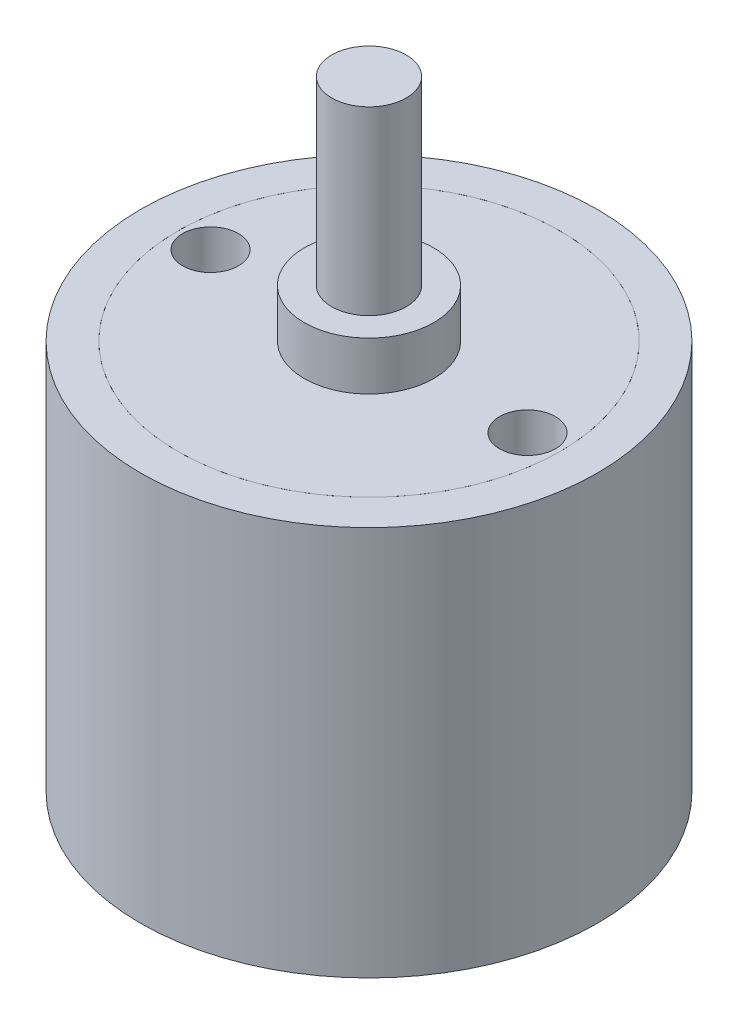
ISO-10303-21;
HEADER;
FILE_DESCRIPTION(('STEP AP214'),'2;1');
FILE_NAME('part.step','',(''),(''),'','','');
FILE_SCHEMA(('AUTOMOTIVE_DESIGN { 1 0 10303 214 1 1 1 1 }'));
ENDSEC;
DATA;
#1=APPLICATION_CONTEXT('core data for automotive mechanical design processes');
#2=APPLICATION_PROTOCOL_DEFINITION('international standard','automotive_design',2000,#1);
#3=PRODUCT_CONTEXT('',#1,'mechanical');
#4=PRODUCT('Part','Part','',(#3));
#5=PRODUCT_RELATED_PRODUCT_CATEGORY('part','',(#4));
#6=PRODUCT_DEFINITION_FORMATION('','',#4);
#7=PRODUCT_DEFINITION_CONTEXT('part definition',#1,'design');
#8=PRODUCT_DEFINITION('design','',#6,#7);
#9=PRODUCT_DEFINITION_SHAPE('','',#8);
#10=(LENGTH_UNIT() NAMED_UNIT(*) SI_UNIT(.MILLI.,.METRE.));
#11=(NAMED_UNIT(*) PLANE_ANGLE_UNIT() SI_UNIT($,.RADIAN.));
#12=(NAMED_UNIT(*) SI_UNIT($,.STERADIAN.) SOLID_ANGLE_UNIT());
#13=UNCERTAINTY_MEASURE_WITH_UNIT(LENGTH_MEASURE(1.E-05),#10,'distance_accuracy_value','');
#14=(GEOMETRIC_REPRESENTATION_CONTEXT(3) GLOBAL_UNCERTAINTY_ASSIGNED_CONTEXT((#13)) GLOBAL_UNIT_ASSIGNED_CONTEXT((#10,
#11,#12)) REPRESENTATION_CONTEXT('',''));
#15=CARTESIAN_POINT('',(0.,0.,0.));
#16=DIRECTION('',(0.,0.,1.));
#17=DIRECTION('',(1.,0.,0.));
#18=AXIS2_PLACEMENT_3D('',#15,#16,#17);
#19=CARTESIAN_POINT('',(0.,18.42,0.));
#20=DIRECTION('',(0.,1.,0.));
#21=DIRECTION('',(0.,0.,1.));
#22=AXIS2_PLACEMENT_3D('',#19,#20,#21);
#23=CYLINDRICAL_SURFACE('',#22,10.25);
#24=CARTESIAN_POINT('',(0.,18.42,0.));
#25=DIRECTION('',(0.,1.,0.));
#26=DIRECTION('',(0.,0.,1.));
#27=AXIS2_PLACEMENT_3D('',#24,#25,#26);
#28=CIRCLE('',#27,10.25);
#29=CARTESIAN_POINT('',(0.,18.42,10.25));
#30=VERTEX_POINT('',#29);
#31=EDGE_CURVE('E11',#30,#30,#28,.T.);
#32=ORIENTED_EDGE('',*,*,#31,.T.);
#33=EDGE_LOOP('',(#32));
#34=FACE_BOUND('',#33,.T.);
#35=CARTESIAN_POINT('',(0.,20.92,0.));
#36=DIRECTION('',(0.,1.,0.));
#37=DIRECTION('',(0.,0.,1.));
#38=AXIS2_PLACEMENT_3D('',#35,#36,#37);
#39=CIRCLE('',#38,10.25);
#40=CARTESIAN_POINT('',(0.,20.92,10.25));
#41=VERTEX_POINT('',#40);
#42=EDGE_CURVE('E62',#41,#41,#39,.T.);
#43=ORIENTED_EDGE('',*,*,#42,.F.);
#44=EDGE_LOOP('',(#43));
#45=FACE_BOUND('',#44,.T.);
#46=ADVANCED_FACE('F59',(#34,#45),#23,.T.);
#47=CARTESIAN_POINT('',(0.,18.42,0.));
#48=DIRECTION('',(0.,1.,0.));
#49=DIRECTION('',(0.,0.,1.));
#50=AXIS2_PLACEMENT_3D('',#47,#48,#49);
#51=PLANE('',#50);
#52=CARTESIAN_POINT('',(-8.5,18.42,0.));
#53=DIRECTION('',(0.,1.,0.));
#54=DIRECTION('',(0.,0.,1.));
#55=AXIS2_PLACEMENT_3D('',#52,#53,#54);
#56=CIRCLE('',#55,1.5);
#57=CARTESIAN_POINT('',(-8.5,18.42,1.5));
#58=VERTEX_POINT('',#57);
#59=EDGE_CURVE('E69',#58,#58,#56,.F.);
#60=ORIENTED_EDGE('',*,*,#59,.F.);
#61=EDGE_LOOP('',(#60));
#62=FACE_BOUND('',#61,.T.);
#63=CARTESIAN_POINT('',(8.5,18.42,0.));
#64=DIRECTION('',(0.,1.,0.));
#65=DIRECTION('',(0.,0.,1.));
#66=AXIS2_PLACEMENT_3D('',#63,#64,#65);
#67=CIRCLE('',#66,1.5);
#68=CARTESIAN_POINT('',(8.5,18.42,1.5));
#69=VERTEX_POINT('',#68);
#70=EDGE_CURVE('E75',#69,#69,#67,.F.);
#71=ORIENTED_EDGE('',*,*,#70,.F.);
#72=EDGE_LOOP('',(#71));
#73=FACE_BOUND('',#72,.T.);
#74=ORIENTED_EDGE('',*,*,#31,.F.);
#75=EDGE_LOOP('',(#74));
#76=FACE_BOUND('',#75,.T.);
#77=ADVANCED_FACE('F90',(#62,#73,#76),#51,.F.);
#78=CARTESIAN_POINT('',(0.,20.92,0.));
#79=DIRECTION('',(0.,1.,0.));
#80=DIRECTION('',(0.,0.,1.));
#81=AXIS2_PLACEMENT_3D('',#78,#79,#80);
#82=PLANE('',#81);
#83=CARTESIAN_POINT('',(-8.5,20.92,0.));
#84=DIRECTION('',(0.,1.,0.));
#85=DIRECTION('',(0.,0.,1.));
#86=AXIS2_PLACEMENT_3D('',#83,#84,#85);
#87=CIRCLE('',#86,1.5);
#88=CARTESIAN_POINT('',(-8.5,20.92,1.5));
#89=VERTEX_POINT('',#88);
#90=EDGE_CURVE('E74',#89,#89,#87,.T.);
#91=ORIENTED_EDGE('',*,*,#90,.F.);
#92=EDGE_LOOP('',(#91));
#93=FACE_BOUND('',#92,.T.);
#94=CARTESIAN_POINT('',(8.5,20.92,0.));
#95=DIRECTION('',(0.,1.,0.));
#96=DIRECTION('',(0.,0.,1.));
#97=AXIS2_PLACEMENT_3D('',#94,#95,#96);
#98=CIRCLE('',#97,1.5);
#99=CARTESIAN_POINT('',(8.5,20.92,1.5));
#100=VERTEX_POINT('',#99);
#101=EDGE_CURVE('E71',#100,#100,#98,.T.);
#102=ORIENTED_EDGE('',*,*,#101,.F.);
#103=EDGE_LOOP('',(#102));
#104=FACE_BOUND('',#103,.T.);
#105=ORIENTED_EDGE('',*,*,#42,.T.);
#106=EDGE_LOOP('',(#105));
#107=FACE_BOUND('',#106,.T.);
#108=ADVANCED_FACE('F86',(#93,#104,#107),#82,.T.);
#109=CARTESIAN_POINT('',(8.5,-0.001000000000001,0.));
#110=DIRECTION('',(0.,1.,0.));
#111=DIRECTION('',(0.,0.,1.));
#112=AXIS2_PLACEMENT_3D('',#109,#110,#111);
#113=CYLINDRICAL_SURFACE('',#112,1.5);
#114=ORIENTED_EDGE('',*,*,#101,.T.);
#115=EDGE_LOOP('',(#114));
#116=FACE_BOUND('',#115,.T.);
#117=ORIENTED_EDGE('',*,*,#70,.T.);
#118=EDGE_LOOP('',(#117));
#119=FACE_BOUND('',#118,.T.);
#120=ADVANCED_FACE('F89',(#116,#119),#113,.F.);
#121=CARTESIAN_POINT('',(-8.5,-0.001000000000001,0.));
#122=DIRECTION('',(0.,1.,0.));
#123=DIRECTION('',(0.,0.,1.));
#124=AXIS2_PLACEMENT_3D('',#121,#122,#123);
#125=CYLINDRICAL_SURFACE('',#124,1.5);
#126=ORIENTED_EDGE('',*,*,#90,.T.);
#127=EDGE_LOOP('',(#126));
#128=FACE_BOUND('',#127,.T.);
#129=ORIENTED_EDGE('',*,*,#59,.T.);
#130=EDGE_LOOP('',(#129));
#131=FACE_BOUND('',#130,.T.);
#132=ADVANCED_FACE('F83',(#128,#131),#125,.F.);
#133=CLOSED_SHELL('',(#46,#77,#108,#120,#132));
#134=MANIFOLD_SOLID_BREP('B2',#133);
#135=CARTESIAN_POINT('',(0.,23.52,0.));
#136=DIRECTION('',(0.,1.,0.));
#137=DIRECTION('',(0.,0.,1.));
#138=AXIS2_PLACEMENT_3D('',#135,#136,#137);
#139=PLANE('',#138);
#140=CARTESIAN_POINT('',(0.,23.52,0.));
#141=DIRECTION('',(0.,1.,0.));
#142=DIRECTION('',(0.,0.,1.));
#143=AXIS2_PLACEMENT_3D('',#140,#141,#142);
#144=CIRCLE('',#143,3.475);
#145=CARTESIAN_POINT('',(0.,23.52,3.475));
#146=VERTEX_POINT('',#145);
#147=EDGE_CURVE('E58',#146,#146,#144,.T.);
#148=ORIENTED_EDGE('',*,*,#147,.T.);
#149=EDGE_LOOP('',(#148));
#150=FACE_BOUND('',#149,.T.);
#151=CARTESIAN_POINT('',(0.,23.52,0.));
#152=DIRECTION('',(0.,1.,0.));
#153=DIRECTION('',(0.,0.,1.));
#154=AXIS2_PLACEMENT_3D('',#151,#152,#153);
#155=CIRCLE('',#154,2.);
#156=CARTESIAN_POINT('',(0.,23.52,2.));
#157=VERTEX_POINT('',#156);
#158=EDGE_CURVE('E172',#157,#157,#155,.T.);
#159=ORIENTED_EDGE('',*,*,#158,.F.);
#160=EDGE_LOOP('',(#159));
#161=FACE_BOUND('',#160,.T.);
#162=ADVANCED_FACE('F161',(#150,#161),#139,.T.);
#163=CARTESIAN_POINT('',(0.,20.92,0.));
#164=DIRECTION('',(0.,1.,0.));
#165=DIRECTION('',(0.,0.,1.));
#166=AXIS2_PLACEMENT_3D('',#163,#164,#165);
#167=PLANE('',#166);
#168=CARTESIAN_POINT('',(0.,20.92,0.));
#169=DIRECTION('',(0.,1.,0.));
#170=DIRECTION('',(0.,0.,1.));
#171=AXIS2_PLACEMENT_3D('',#168,#169,#170);
#172=CIRCLE('',#171,3.475);
#173=CARTESIAN_POINT('',(0.,20.92,3.475));
#174=VERTEX_POINT('',#173);
#175=EDGE_CURVE('E165',#174,#174,#172,.T.);
#176=ORIENTED_EDGE('',*,*,#175,.F.);
#177=EDGE_LOOP('',(#176));
#178=FACE_BOUND('',#177,.T.);
#179=CARTESIAN_POINT('',(0.,20.92,0.));
#180=DIRECTION('',(0.,1.,0.));
#181=DIRECTION('',(0.,0.,1.));
#182=AXIS2_PLACEMENT_3D('',#179,#180,#181);
#183=CIRCLE('',#182,2.);
#184=CARTESIAN_POINT('',(0.,20.92,2.));
#185=VERTEX_POINT('',#184);
#186=EDGE_CURVE('E174',#185,#185,#183,.T.);
#187=ORIENTED_EDGE('',*,*,#186,.T.);
#188=EDGE_LOOP('',(#187));
#189=FACE_BOUND('',#188,.T.);
#190=ADVANCED_FACE('F184',(#178,#189),#167,.F.);
#191=CARTESIAN_POINT('',(0.,23.52,0.));
#192=DIRECTION('',(0.,-1.,0.));
#193=DIRECTION('',(0.,0.,-1.));
#194=AXIS2_PLACEMENT_3D('',#191,#192,#193);
#195=CYLINDRICAL_SURFACE('',#194,3.475);
#196=ORIENTED_EDGE('',*,*,#147,.F.);
#197=EDGE_LOOP('',(#196));
#198=FACE_BOUND('',#197,.T.);
#199=ORIENTED_EDGE('',*,*,#175,.T.);
#200=EDGE_LOOP('',(#199));
#201=FACE_BOUND('',#200,.T.);
#202=ADVANCED_FACE('F163',(#198,#201),#195,.T.);
#203=CARTESIAN_POINT('',(0.,23.52,0.));
#204=DIRECTION('',(0.,-1.,0.));
#205=DIRECTION('',(0.,0.,-1.));
#206=AXIS2_PLACEMENT_3D('',#203,#204,#205);
#207=CYLINDRICAL_SURFACE('',#206,2.);
#208=ORIENTED_EDGE('',*,*,#158,.T.);
#209=EDGE_LOOP('',(#208));
#210=FACE_BOUND('',#209,.T.);
#211=ORIENTED_EDGE('',*,*,#186,.F.);
#212=EDGE_LOOP('',(#211));
#213=FACE_BOUND('',#212,.T.);
#214=ADVANCED_FACE('F180',(#210,#213),#207,.F.);
#215=CLOSED_SHELL('',(#162,#190,#202,#214));
#216=MANIFOLD_SOLID_BREP('B6',#215);
#217=CARTESIAN_POINT('',(0.,33.22,0.));
#218=DIRECTION('',(0.,-1.,0.));
#219=DIRECTION('',(0.,0.,-1.));
#220=AXIS2_PLACEMENT_3D('',#217,#218,#219);
#221=CYLINDRICAL_SURFACE('',#220,2.);
#222=CARTESIAN_POINT('',(0.,33.22,0.));
#223=DIRECTION('',(0.,1.,0.));
#224=DIRECTION('',(0.,0.,1.));
#225=AXIS2_PLACEMENT_3D('',#222,#223,#224);
#226=CIRCLE('',#225,2.);
#227=CARTESIAN_POINT('',(0.,33.22,2.));
#228=VERTEX_POINT('',#227);
#229=EDGE_CURVE('E160',#228,#228,#226,.T.);
#230=ORIENTED_EDGE('',*,*,#229,.F.);
#231=EDGE_LOOP('',(#230));
#232=FACE_BOUND('',#231,.T.);
#233=CARTESIAN_POINT('',(0.,20.92,0.));
#234=DIRECTION('',(0.,1.,0.));
#235=DIRECTION('',(0.,0.,1.));
#236=AXIS2_PLACEMENT_3D('',#233,#234,#235);
#237=CIRCLE('',#236,2.);
#238=CARTESIAN_POINT('',(0.,20.92,2.));
#239=VERTEX_POINT('',#238);
#240=EDGE_CURVE('E248',#239,#239,#237,.T.);
#241=ORIENTED_EDGE('',*,*,#240,.T.);
#242=EDGE_LOOP('',(#241));
#243=FACE_BOUND('',#242,.T.);
#244=ADVANCED_FACE('F245',(#232,#243),#221,.T.);
#245=CARTESIAN_POINT('',(0.,33.22,0.));
#246=DIRECTION('',(0.,1.,0.));
#247=DIRECTION('',(0.,0.,1.));
#248=AXIS2_PLACEMENT_3D('',#245,#246,#247);
#249=PLANE('',#248);
#250=ORIENTED_EDGE('',*,*,#229,.T.);
#251=EDGE_LOOP('',(#250));
#252=FACE_BOUND('',#251,.T.);
#253=ADVANCED_FACE('F260',(#252),#249,.T.);
#254=CARTESIAN_POINT('',(0.,20.92,0.));
#255=DIRECTION('',(0.,1.,0.));
#256=DIRECTION('',(0.,0.,1.));
#257=AXIS2_PLACEMENT_3D('',#254,#255,#256);
#258=PLANE('',#257);
#259=ORIENTED_EDGE('',*,*,#240,.F.);
#260=EDGE_LOOP('',(#259));
#261=FACE_BOUND('',#260,.T.);
#262=ADVANCED_FACE('F258',(#261),#258,.F.);
#263=CLOSED_SHELL('',(#244,#253,#262));
#264=MANIFOLD_SOLID_BREP('B53',#263);
#265=CARTESIAN_POINT('',(0.,20.92,0.));
#266=DIRECTION('',(0.,-1.,0.));
#267=DIRECTION('',(0.,0.,-1.));
#268=AXIS2_PLACEMENT_3D('',#265,#266,#267);
#269=CYLINDRICAL_SURFACE('',#268,12.25);
#270=CARTESIAN_POINT('',(0.,20.92,0.));
#271=DIRECTION('',(0.,1.,0.));
#272=DIRECTION('',(0.,0.,1.));
#273=AXIS2_PLACEMENT_3D('',#270,#271,#272);
#274=CIRCLE('',#273,12.25);
#275=CARTESIAN_POINT('',(0.,20.92,-12.25));
#276=VERTEX_POINT('',#275);
#277=EDGE_CURVE('E244',#276,#276,#274,.T.);
#278=CARTESIAN_POINT('',(0.,0.,0.));
#279=DIRECTION('',(0.,1.,0.));
#280=DIRECTION('',(0.,0.,1.));
#281=AXIS2_PLACEMENT_3D('',#278,#279,#280);
#282=CIRCLE('',#281,12.25);
#283=CARTESIAN_POINT('',(0.,0.,-12.25));
#284=VERTEX_POINT('',#283);
#285=EDGE_CURVE('E305',#284,#284,#282,.T.);
#286=CARTESIAN_POINT('',(0.,20.92,-12.25));
#287=CARTESIAN_POINT('',(0.,20.7020833333333,-12.25));
#288=CARTESIAN_POINT('',(0.,20.4841666666667,-12.25));
#289=CARTESIAN_POINT('',(0.,20.0483333333333,-12.25));
#290=CARTESIAN_POINT('',(0.,19.8304166666667,-12.25));
#291=CARTESIAN_POINT('',(0.,19.3945833333333,-12.25));
#292=CARTESIAN_POINT('',(0.,19.1766666666667,-12.25));
#293=CARTESIAN_POINT('',(0.,18.7408333333333,-12.25));
#294=CARTESIAN_POINT('',(0.,18.5229166666667,-12.25));
#295=CARTESIAN_POINT('',(0.,18.0870833333333,-12.25));
#296=CARTESIAN_POINT('',(0.,17.8691666666667,-12.25));
#297=CARTESIAN_POINT('',(0.,17.4333333333333,-12.25));
#298=CARTESIAN_POINT('',(0.,17.2154166666667,-12.25));
#299=CARTESIAN_POINT('',(0.,16.7795833333333,-12.25));
#300=CARTESIAN_POINT('',(0.,16.5616666666667,-12.25));
#301=CARTESIAN_POINT('',(0.,16.1258333333333,-12.25));
#302=CARTESIAN_POINT('',(0.,15.9079166666667,-12.25));
#303=CARTESIAN_POINT('',(0.,15.4720833333333,-12.25));
#304=CARTESIAN_POINT('',(0.,15.2541666666667,-12.25));
#305=CARTESIAN_POINT('',(0.,14.8183333333333,-12.25));
#306=CARTESIAN_POINT('',(0.,14.6004166666667,-12.25));
#307=CARTESIAN_POINT('',(0.,14.1645833333333,-12.25));
#308=CARTESIAN_POINT('',(0.,13.9466666666667,-12.25));
#309=CARTESIAN_POINT('',(0.,13.5108333333333,-12.25));
#310=CARTESIAN_POINT('',(0.,13.2929166666667,-12.25));
#311=CARTESIAN_POINT('',(0.,12.8570833333333,-12.25));
#312=CARTESIAN_POINT('',(0.,12.6391666666667,-12.25));
#313=CARTESIAN_POINT('',(0.,12.2033333333333,-12.25));
#314=CARTESIAN_POINT('',(0.,11.9854166666667,-12.25));
#315=CARTESIAN_POINT('',(0.,11.5495833333333,-12.25));
#316=CARTESIAN_POINT('',(0.,11.3316666666667,-12.25));
#317=CARTESIAN_POINT('',(0.,10.8958333333333,-12.25));
#318=CARTESIAN_POINT('',(0.,10.6779166666667,-12.25));
#319=CARTESIAN_POINT('',(0.,10.2420833333333,-12.25));
#320=CARTESIAN_POINT('',(0.,10.0241666666667,-12.25));
#321=CARTESIAN_POINT('',(0.,9.58833333333333,-12.25));
#322=CARTESIAN_POINT('',(0.,9.37041666666667,-12.25));
#323=CARTESIAN_POINT('',(0.,8.93458333333333,-12.25));
#324=CARTESIAN_POINT('',(0.,8.71666666666667,-12.25));
#325=CARTESIAN_POINT('',(0.,8.28083333333333,-12.25));
#326=CARTESIAN_POINT('',(0.,8.06291666666666,-12.25));
#327=CARTESIAN_POINT('',(0.,7.62708333333333,-12.25));
#328=CARTESIAN_POINT('',(0.,7.40916666666666,-12.25));
#329=CARTESIAN_POINT('',(0.,6.97333333333333,-12.25));
#330=CARTESIAN_POINT('',(0.,6.75541666666666,-12.25));
#331=CARTESIAN_POINT('',(0.,6.31958333333333,-12.25));
#332=CARTESIAN_POINT('',(0.,6.10166666666666,-12.25));
#333=CARTESIAN_POINT('',(0.,5.66583333333333,-12.25));
#334=CARTESIAN_POINT('',(0.,5.44791666666667,-12.25));
#335=CARTESIAN_POINT('',(0.,5.01208333333333,-12.25));
#336=CARTESIAN_POINT('',(0.,4.79416666666666,-12.25));
#337=CARTESIAN_POINT('',(0.,4.35833333333333,-12.25));
#338=CARTESIAN_POINT('',(0.,4.14041666666667,-12.25));
#339=CARTESIAN_POINT('',(0.,3.70458333333333,-12.25));
#340=CARTESIAN_POINT('',(0.,3.48666666666666,-12.25));
#341=CARTESIAN_POINT('',(0.,3.05083333333333,-12.25));
#342=CARTESIAN_POINT('',(0.,2.83291666666666,-12.25));
#343=CARTESIAN_POINT('',(0.,2.39708333333333,-12.25));
#344=CARTESIAN_POINT('',(0.,2.17916666666666,-12.25));
#345=CARTESIAN_POINT('',(0.,1.74333333333333,-12.25));
#346=CARTESIAN_POINT('',(0.,1.52541666666666,-12.25));
#347=CARTESIAN_POINT('',(0.,1.08958333333333,-12.25));
#348=CARTESIAN_POINT('',(0.,0.871666666666664,-12.25));
#349=CARTESIAN_POINT('',(0.,0.435833333333331,-12.25));
#350=CARTESIAN_POINT('',(0.,0.217916666666664,-12.25));
#351=CARTESIAN_POINT('',(0.,0.,-12.25));
#352=B_SPLINE_CURVE_WITH_KNOTS('',3,(#286,#287,#288,#289,#290,#291,#292,#293,#294,#295,#296,
#297,#298,#299,#300,#301,#302,#303,#304,#305,#306,#307,#308,#309,#310,#311,#312,#313,#314,#315,
#316,#317,#318,#319,#320,#321,#322,#323,#324,#325,#326,#327,#328,#329,#330,#331,#332,#333,#334,
#335,#336,#337,#338,#339,#340,#341,#342,#343,#344,#345,#346,#347,#348,#349,#350,#351),
.UNSPECIFIED.,.F.,.F.,(4,2,2,2,2,2,2,2,2,2,2,2,2,2,2,2,2,2,2,2,2,2,2,2,2,2,2,2,2,2,2,2,4),(0.,
0.653749999999998,1.3075,1.96125,2.615,3.26875,3.9225,4.57625,5.23,5.88375,6.5375,7.19125,7.845,
8.49875,9.1525,9.80625,10.46,11.11375,11.7675,12.42125,13.075,13.72875,14.3825,15.03625,15.69,
16.34375,16.9975,17.65125,18.305,18.95875,19.6125,20.26625,20.92),.UNSPECIFIED.);
#353=EDGE_CURVE('BSEAM297',#276,#284,#352,.T.);
#354=ORIENTED_EDGE('',*,*,#277,.F.);
#355=ORIENTED_EDGE('',*,*,#285,.T.);
#356=ORIENTED_EDGE('',*,*,#353,.T.);
#357=ORIENTED_EDGE('',*,*,#353,.F.);
#358=EDGE_LOOP('',(#354,#356,#355,#357));
#359=FACE_BOUND('',#358,.T.);
#360=ADVANCED_FACE('F297',(#359),#269,.T.);
#361=CARTESIAN_POINT('',(0.,20.92,0.));
#362=DIRECTION('',(0.,1.,0.));
#363=DIRECTION('',(0.,0.,1.));
#364=AXIS2_PLACEMENT_3D('',#361,#362,#363);
#365=PLANE('',#364);
#366=CARTESIAN_POINT('',(0.,20.92,0.));
#367=DIRECTION('',(0.,1.,0.));
#368=DIRECTION('',(0.,0.,1.));
#369=AXIS2_PLACEMENT_3D('',#366,#367,#368);
#370=CIRCLE('',#369,10.25);
#371=CARTESIAN_POINT('',(0.,20.92,-10.25));
#372=VERTEX_POINT('',#371);
#373=EDGE_CURVE('E311',#372,#372,#370,.T.);
#374=ORIENTED_EDGE('',*,*,#373,.F.);
#375=EDGE_LOOP('',(#374));
#376=FACE_BOUND('',#375,.T.);
#377=ORIENTED_EDGE('',*,*,#277,.T.);
#378=EDGE_LOOP('',(#377));
#379=FACE_BOUND('',#378,.T.);
#380=ADVANCED_FACE('F355',(#376,#379),#365,.T.);
#381=CARTESIAN_POINT('',(0.,0.,0.));
#382=DIRECTION('',(0.,1.,0.));
#383=DIRECTION('',(0.,0.,1.));
#384=AXIS2_PLACEMENT_3D('',#381,#382,#383);
#385=PLANE('',#384);
#386=CARTESIAN_POINT('',(0.,0.,-8.5));
#387=DIRECTION('',(0.,-1.,0.));
#388=DIRECTION('',(0.,0.,-1.));
#389=AXIS2_PLACEMENT_3D('',#386,#387,#388);
#390=CIRCLE('',#389,1.6);
#391=CARTESIAN_POINT('',(0.,0.,-10.1));
#392=VERTEX_POINT('',#391);
#393=EDGE_CURVE('E341',#392,#392,#390,.T.);
#394=ORIENTED_EDGE('',*,*,#393,.F.);
#395=EDGE_LOOP('',(#394));
#396=FACE_BOUND('',#395,.T.);
#397=CARTESIAN_POINT('',(0.,0.,8.5));
#398=DIRECTION('',(0.,-1.,0.));
#399=DIRECTION('',(0.,0.,-1.));
#400=AXIS2_PLACEMENT_3D('',#397,#398,#399);
#401=CIRCLE('',#400,1.6);
#402=CARTESIAN_POINT('',(0.,0.,6.9));
#403=VERTEX_POINT('',#402);
#404=EDGE_CURVE('E340',#403,#403,#401,.T.);
#405=ORIENTED_EDGE('',*,*,#404,.F.);
#406=EDGE_LOOP('',(#405));
#407=FACE_BOUND('',#406,.T.);
#408=CARTESIAN_POINT('',(0.,0.,0.));
#409=DIRECTION('',(0.,-1.,0.));
#410=DIRECTION('',(0.,0.,-1.));
#411=AXIS2_PLACEMENT_3D('',#408,#409,#410);
#412=CIRCLE('',#411,3.175);
#413=CARTESIAN_POINT('',(0.,0.,-3.175));
#414=VERTEX_POINT('',#413);
#415=EDGE_CURVE('E320',#414,#414,#412,.T.);
#416=ORIENTED_EDGE('',*,*,#415,.F.);
#417=EDGE_LOOP('',(#416));
#418=FACE_BOUND('',#417,.T.);
#419=ORIENTED_EDGE('',*,*,#285,.F.);
#420=EDGE_LOOP('',(#419));
#421=FACE_BOUND('',#420,.T.);
#422=ADVANCED_FACE('F351',(#396,#407,#418,#421),#385,.F.);
#423=CARTESIAN_POINT('',(0.,20.92,0.));
#424=DIRECTION('',(0.,-1.,0.));
#425=DIRECTION('',(0.,0.,-1.));
#426=AXIS2_PLACEMENT_3D('',#423,#424,#425);
#427=CYLINDRICAL_SURFACE('',#426,10.25);
#428=CARTESIAN_POINT('',(0.,3.2,0.));
#429=DIRECTION('',(0.,1.,0.));
#430=DIRECTION('',(0.,0.,1.));
#431=AXIS2_PLACEMENT_3D('',#428,#429,#430);
#432=CIRCLE('',#431,10.25);
#433=CARTESIAN_POINT('',(0.,3.2,-10.25));
#434=VERTEX_POINT('',#433);
#435=EDGE_CURVE('E327',#434,#434,#432,.T.);
#436=CARTESIAN_POINT('',(0.,20.92,-10.25));
#437=CARTESIAN_POINT('',(0.,20.7354166666667,-10.25));
#438=CARTESIAN_POINT('',(0.,20.5508333333333,-10.25));
#439=CARTESIAN_POINT('',(0.,20.1816666666667,-10.25));
#440=CARTESIAN_POINT('',(0.,19.9970833333333,-10.25));
#441=CARTESIAN_POINT('',(0.,19.6279166666667,-10.25));
#442=CARTESIAN_POINT('',(0.,19.4433333333333,-10.25));
#443=CARTESIAN_POINT('',(0.,19.0741666666667,-10.25));
#444=CARTESIAN_POINT('',(0.,18.8895833333333,-10.25));
#445=CARTESIAN_POINT('',(0.,18.5204166666667,-10.25));
#446=CARTESIAN_POINT('',(0.,18.3358333333333,-10.25));
#447=CARTESIAN_POINT('',(0.,17.9666666666667,-10.25));
#448=CARTESIAN_POINT('',(0.,17.7820833333333,-10.25));
#449=CARTESIAN_POINT('',(0.,17.4129166666667,-10.25));
#450=CARTESIAN_POINT('',(0.,17.2283333333333,-10.25));
#451=CARTESIAN_POINT('',(0.,16.8591666666667,-10.25));
#452=CARTESIAN_POINT('',(0.,16.6745833333333,-10.25));
#453=CARTESIAN_POINT('',(0.,16.3054166666667,-10.25));
#454=CARTESIAN_POINT('',(0.,16.1208333333333,-10.25));
#455=CARTESIAN_POINT('',(0.,15.7516666666667,-10.25));
#456=CARTESIAN_POINT('',(0.,15.5670833333333,-10.25));
#457=CARTESIAN_POINT('',(0.,15.1979166666667,-10.25));
#458=CARTESIAN_POINT('',(0.,15.0133333333333,-10.25));
#459=CARTESIAN_POINT('',(0.,14.6441666666667,-10.25));
#460=CARTESIAN_POINT('',(0.,14.4595833333333,-10.25));
#461=CARTESIAN_POINT('',(0.,14.0904166666667,-10.25));
#462=CARTESIAN_POINT('',(0.,13.9058333333333,-10.25));
#463=CARTESIAN_POINT('',(0.,13.5366666666667,-10.25));
#464=CARTESIAN_POINT('',(0.,13.3520833333333,-10.25));
#465=CARTESIAN_POINT('',(0.,12.9829166666667,-10.25));
#466=CARTESIAN_POINT('',(0.,12.7983333333333,-10.25));
#467=CARTESIAN_POINT('',(0.,12.4291666666667,-10.25));
#468=CARTESIAN_POINT('',(0.,12.2445833333333,-10.25));
#469=CARTESIAN_POINT('',(0.,11.8754166666667,-10.25));
#470=CARTESIAN_POINT('',(0.,11.6908333333333,-10.25));
#471=CARTESIAN_POINT('',(0.,11.3216666666667,-10.25));
#472=CARTESIAN_POINT('',(0.,11.1370833333333,-10.25));
#473=CARTESIAN_POINT('',(0.,10.7679166666667,-10.25));
#474=CARTESIAN_POINT('',(0.,10.5833333333333,-10.25));
#475=CARTESIAN_POINT('',(0.,10.2141666666667,-10.25));
#476=CARTESIAN_POINT('',(0.,10.0295833333333,-10.25));
#477=CARTESIAN_POINT('',(0.,9.66041666666667,-10.25));
#478=CARTESIAN_POINT('',(0.,9.47583333333333,-10.25));
#479=CARTESIAN_POINT('',(0.,9.10666666666667,-10.25));
#480=CARTESIAN_POINT('',(0.,8.92208333333333,-10.25));
#481=CARTESIAN_POINT('',(0.,8.55291666666666,-10.25));
#482=CARTESIAN_POINT('',(0.,8.36833333333333,-10.25));
#483=CARTESIAN_POINT('',(0.,7.99916666666666,-10.25));
#484=CARTESIAN_POINT('',(0.,7.81458333333333,-10.25));
#485=CARTESIAN_POINT('',(0.,7.44541666666667,-10.25));
#486=CARTESIAN_POINT('',(0.,7.26083333333333,-10.25));
#487=CARTESIAN_POINT('',(0.,6.89166666666667,-10.25));
#488=CARTESIAN_POINT('',(0.,6.70708333333333,-10.25));
#489=CARTESIAN_POINT('',(0.,6.33791666666666,-10.25));
#490=CARTESIAN_POINT('',(0.,6.15333333333333,-10.25));
#491=CARTESIAN_POINT('',(0.,5.78416666666666,-10.25));
#492=CARTESIAN_POINT('',(0.,5.59958333333333,-10.25));
#493=CARTESIAN_POINT('',(0.,5.23041666666666,-10.25));
#494=CARTESIAN_POINT('',(0.,5.04583333333333,-10.25));
#495=CARTESIAN_POINT('',(0.,4.67666666666666,-10.25));
#496=CARTESIAN_POINT('',(0.,4.49208333333333,-10.25));
#497=CARTESIAN_POINT('',(0.,4.12291666666666,-10.25));
#498=CARTESIAN_POINT('',(0.,3.93833333333333,-10.25));
#499=CARTESIAN_POINT('',(0.,3.56916666666666,-10.25));
#500=CARTESIAN_POINT('',(0.,3.38458333333333,-10.25));
#501=CARTESIAN_POINT('',(0.,3.2,-10.25));
#502=B_SPLINE_CURVE_WITH_KNOTS('',3,(#436,#437,#438,#439,#440,#441,#442,#443,#444,#445,#446,
#447,#448,#449,#450,#451,#452,#453,#454,#455,#456,#457,#458,#459,#460,#461,#462,#463,#464,#465,
#466,#467,#468,#469,#470,#471,#472,#473,#474,#475,#476,#477,#478,#479,#480,#481,#482,#483,#484,
#485,#486,#487,#488,#489,#490,#491,#492,#493,#494,#495,#496,#497,#498,#499,#500,#501),
.UNSPECIFIED.,.F.,.F.,(4,2,2,2,2,2,2,2,2,2,2,2,2,2,2,2,2,2,2,2,2,2,2,2,2,2,2,2,2,2,2,2,4),(0.,
0.553749999999999,1.1075,1.66125,2.215,2.76875,3.3225,3.87625,4.43,4.98375,5.5375,6.09125,6.645,
7.19875,7.7525,8.30625,8.86,9.41375,9.9675,10.52125,11.075,11.62875,12.1825,12.73625,13.29,
13.84375,14.3975,14.95125,15.505,16.05875,16.6125,17.16625,17.72),.UNSPECIFIED.);
#503=EDGE_CURVE('BSEAM354',#372,#434,#502,.T.);
#504=ORIENTED_EDGE('',*,*,#373,.T.);
#505=ORIENTED_EDGE('',*,*,#435,.F.);
#506=ORIENTED_EDGE('',*,*,#503,.T.);
#507=ORIENTED_EDGE('',*,*,#503,.F.);
#508=EDGE_LOOP('',(#504,#506,#505,#507));
#509=FACE_BOUND('',#508,.T.);
#510=ADVANCED_FACE('F354',(#509),#427,.F.);
#511=CARTESIAN_POINT('',(0.,3.2,0.));
#512=DIRECTION('',(0.,1.,0.));
#513=DIRECTION('',(0.,0.,1.));
#514=AXIS2_PLACEMENT_3D('',#511,#512,#513);
#515=PLANE('',#514);
#516=CARTESIAN_POINT('',(0.,3.2,-8.5));
#517=DIRECTION('',(0.,1.,0.));
#518=DIRECTION('',(0.,0.,1.));
#519=AXIS2_PLACEMENT_3D('',#516,#517,#518);
#520=CIRCLE('',#519,1.6);
#521=CARTESIAN_POINT('',(0.,3.2,-6.9));
#522=VERTEX_POINT('',#521);
#523=EDGE_CURVE('E300',#522,#522,#520,.T.);
#524=ORIENTED_EDGE('',*,*,#523,.F.);
#525=EDGE_LOOP('',(#524));
#526=FACE_BOUND('',#525,.T.);
#527=CARTESIAN_POINT('',(0.,3.2,8.5));
#528=DIRECTION('',(0.,1.,0.));
#529=DIRECTION('',(0.,0.,1.));
#530=AXIS2_PLACEMENT_3D('',#527,#528,#529);
#531=CIRCLE('',#530,1.6);
#532=CARTESIAN_POINT('',(0.,3.2,10.1));
#533=VERTEX_POINT('',#532);
#534=EDGE_CURVE('E319',#533,#533,#531,.T.);
#535=ORIENTED_EDGE('',*,*,#534,.F.);
#536=EDGE_LOOP('',(#535));
#537=FACE_BOUND('',#536,.T.);
#538=CARTESIAN_POINT('',(0.,3.2,0.));
#539=DIRECTION('',(0.,1.,0.));
#540=DIRECTION('',(0.,0.,1.));
#541=AXIS2_PLACEMENT_3D('',#538,#539,#540);
#542=CIRCLE('',#541,3.175);
#543=CARTESIAN_POINT('',(0.,3.2,3.175));
#544=VERTEX_POINT('',#543);
#545=EDGE_CURVE('E316',#544,#544,#542,.T.);
#546=ORIENTED_EDGE('',*,*,#545,.F.);
#547=EDGE_LOOP('',(#546));
#548=FACE_BOUND('',#547,.T.);
#549=ORIENTED_EDGE('',*,*,#435,.T.);
#550=EDGE_LOOP('',(#549));
#551=FACE_BOUND('',#550,.T.);
#552=ADVANCED_FACE('F372',(#526,#537,#548,#551),#515,.T.);
#553=CARTESIAN_POINT('',(0.,8.,0.));
#554=DIRECTION('',(0.,-1.,0.));
#555=DIRECTION('',(0.,0.,-1.));
#556=AXIS2_PLACEMENT_3D('',#553,#554,#555);
#557=CYLINDRICAL_SURFACE('',#556,3.175);
#558=ORIENTED_EDGE('',*,*,#545,.T.);
#559=EDGE_LOOP('',(#558));
#560=FACE_BOUND('',#559,.T.);
#561=ORIENTED_EDGE('',*,*,#415,.T.);
#562=EDGE_LOOP('',(#561));
#563=FACE_BOUND('',#562,.T.);
#564=ADVANCED_FACE('F375',(#560,#563),#557,.F.);
#565=CARTESIAN_POINT('',(0.,8.,8.5));
#566=DIRECTION('',(0.,-1.,0.));
#567=DIRECTION('',(0.,0.,-1.));
#568=AXIS2_PLACEMENT_3D('',#565,#566,#567);
#569=CYLINDRICAL_SURFACE('',#568,1.6);
#570=ORIENTED_EDGE('',*,*,#534,.T.);
#571=EDGE_LOOP('',(#570));
#572=FACE_BOUND('',#571,.T.);
#573=ORIENTED_EDGE('',*,*,#404,.T.);
#574=EDGE_LOOP('',(#573));
#575=FACE_BOUND('',#574,.T.);
#576=ADVANCED_FACE('F349',(#572,#575),#569,.F.);
#577=CARTESIAN_POINT('',(0.,8.,-8.5));
#578=DIRECTION('',(0.,-1.,0.));
#579=DIRECTION('',(0.,0.,-1.));
#580=AXIS2_PLACEMENT_3D('',#577,#578,#579);
#581=CYLINDRICAL_SURFACE('',#580,1.6);
#582=ORIENTED_EDGE('',*,*,#523,.T.);
#583=EDGE_LOOP('',(#582));
#584=FACE_BOUND('',#583,.T.);
#585=ORIENTED_EDGE('',*,*,#393,.T.);
#586=EDGE_LOOP('',(#585));
#587=FACE_BOUND('',#586,.T.);
#588=ADVANCED_FACE('F383',(#584,#587),#581,.F.);
#589=CLOSED_SHELL('',(#360,#380,#422,#510,#552,#564,#576,#588));
#590=MANIFOLD_SOLID_BREP('B155',#589);
#591=ADVANCED_BREP_SHAPE_REPRESENTATION('',(#18,#134,#216,#264,#590),#14);
#592=SHAPE_DEFINITION_REPRESENTATION(#9,#591);
ENDSEC;
END-ISO-10303-21;
